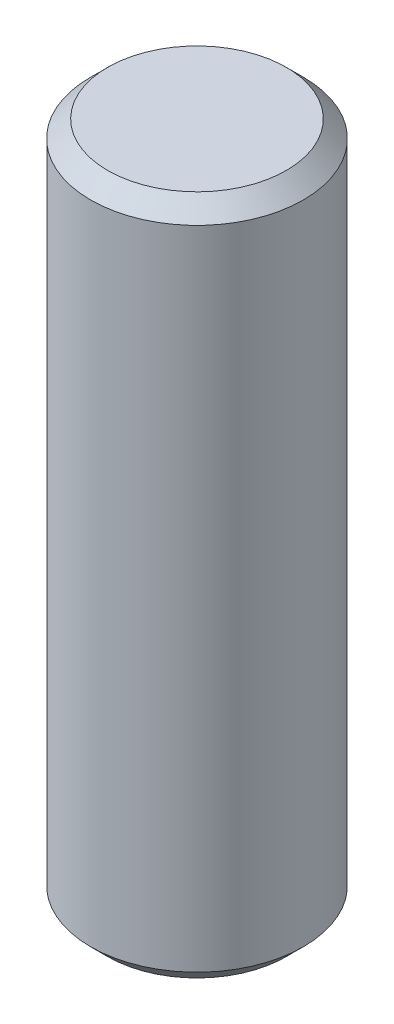
ISO-10303-21;
HEADER;
FILE_DESCRIPTION(('STEP AP214'),'2;1');
FILE_NAME('part.step','',(''),(''),'','','');
FILE_SCHEMA(('AUTOMOTIVE_DESIGN { 1 0 10303 214 1 1 1 1 }'));
ENDSEC;
DATA;
#1=APPLICATION_CONTEXT('core data for automotive mechanical design processes');
#2=APPLICATION_PROTOCOL_DEFINITION('international standard','automotive_design',2000,#1);
#3=PRODUCT_CONTEXT('',#1,'mechanical');
#4=PRODUCT('Part','Part','',(#3));
#5=PRODUCT_RELATED_PRODUCT_CATEGORY('part','',(#4));
#6=PRODUCT_DEFINITION_FORMATION('','',#4);
#7=PRODUCT_DEFINITION_CONTEXT('part definition',#1,'design');
#8=PRODUCT_DEFINITION('design','',#6,#7);
#9=PRODUCT_DEFINITION_SHAPE('','',#8);
#10=(LENGTH_UNIT() NAMED_UNIT(*) SI_UNIT(.MILLI.,.METRE.));
#11=(NAMED_UNIT(*) PLANE_ANGLE_UNIT() SI_UNIT($,.RADIAN.));
#12=(NAMED_UNIT(*) SI_UNIT($,.STERADIAN.) SOLID_ANGLE_UNIT());
#13=UNCERTAINTY_MEASURE_WITH_UNIT(LENGTH_MEASURE(1.E-05),#10,'distance_accuracy_value','');
#14=(GEOMETRIC_REPRESENTATION_CONTEXT(3) GLOBAL_UNCERTAINTY_ASSIGNED_CONTEXT((#13)) GLOBAL_UNIT_ASSIGNED_CONTEXT((#10,
#11,#12)) REPRESENTATION_CONTEXT('',''));
#15=CARTESIAN_POINT('',(0.,0.,0.));
#16=DIRECTION('',(0.,0.,1.));
#17=DIRECTION('',(1.,0.,0.));
#18=AXIS2_PLACEMENT_3D('',#15,#16,#17);
#19=CARTESIAN_POINT('',(0.,-5.08,0.));
#20=DIRECTION('',(0.,1.,0.));
#21=DIRECTION('',(0.,0.,1.));
#22=AXIS2_PLACEMENT_3D('',#19,#20,#21);
#23=CYLINDRICAL_SURFACE('',#22,1.5875);
#24=CARTESIAN_POINT('',(0.,-4.826,0.));
#25=DIRECTION('',(0.,1.,0.));
#26=DIRECTION('',(0.,0.,1.));
#27=AXIS2_PLACEMENT_3D('',#24,#25,#26);
#28=CIRCLE('',#27,1.5875);
#29=CARTESIAN_POINT('',(0.,-4.826,1.5875));
#30=VERTEX_POINT('',#29);
#31=EDGE_CURVE('E41',#30,#30,#28,.T.);
#32=ORIENTED_EDGE('',*,*,#31,.T.);
#33=EDGE_LOOP('',(#32));
#34=FACE_BOUND('',#33,.T.);
#35=CARTESIAN_POINT('',(0.,4.826,0.));
#36=DIRECTION('',(0.,1.,0.));
#37=DIRECTION('',(0.,0.,1.));
#38=AXIS2_PLACEMENT_3D('',#35,#36,#37);
#39=CIRCLE('',#38,1.5875);
#40=CARTESIAN_POINT('',(0.,4.826,1.5875));
#41=VERTEX_POINT('',#40);
#42=EDGE_CURVE('E45',#41,#41,#39,.F.);
#43=ORIENTED_EDGE('',*,*,#42,.T.);
#44=EDGE_LOOP('',(#43));
#45=FACE_BOUND('',#44,.T.);
#46=ADVANCED_FACE('F30',(#34,#45),#23,.T.);
#47=CARTESIAN_POINT('',(0.,-5.08,0.));
#48=DIRECTION('',(0.,1.,0.));
#49=DIRECTION('',(0.,0.,1.));
#50=AXIS2_PLACEMENT_3D('',#47,#48,#49);
#51=PLANE('',#50);
#52=CARTESIAN_POINT('',(0.,-5.08,0.));
#53=DIRECTION('',(0.,1.,0.));
#54=DIRECTION('',(0.,0.,1.));
#55=AXIS2_PLACEMENT_3D('',#52,#53,#54);
#56=CIRCLE('',#55,1.3335);
#57=CARTESIAN_POINT('',(0.,-5.08,1.3335));
#58=VERTEX_POINT('',#57);
#59=EDGE_CURVE('E37',#58,#58,#56,.F.);
#60=ORIENTED_EDGE('',*,*,#59,.T.);
#61=EDGE_LOOP('',(#60));
#62=FACE_BOUND('',#61,.T.);
#63=ADVANCED_FACE('F61',(#62),#51,.F.);
#64=CARTESIAN_POINT('',(0.,5.08,0.));
#65=DIRECTION('',(0.,1.,0.));
#66=DIRECTION('',(0.,0.,1.));
#67=AXIS2_PLACEMENT_3D('',#64,#65,#66);
#68=PLANE('',#67);
#69=CARTESIAN_POINT('',(0.,5.08,0.));
#70=DIRECTION('',(0.,1.,0.));
#71=DIRECTION('',(0.,0.,1.));
#72=AXIS2_PLACEMENT_3D('',#69,#70,#71);
#73=CIRCLE('',#72,1.3335);
#74=CARTESIAN_POINT('',(0.,5.08,1.3335));
#75=VERTEX_POINT('',#74);
#76=EDGE_CURVE('E10',#75,#75,#73,.T.);
#77=ORIENTED_EDGE('',*,*,#76,.T.);
#78=EDGE_LOOP('',(#77));
#79=FACE_BOUND('',#78,.T.);
#80=ADVANCED_FACE('F58',(#79),#68,.T.);
#81=CARTESIAN_POINT('',(0.,-4.826,0.));
#82=DIRECTION('',(0.,1.,0.));
#83=DIRECTION('',(0.,0.,1.));
#84=AXIS2_PLACEMENT_3D('',#81,#82,#83);
#85=CONICAL_SURFACE('',#84,1.5875,0.785398163397452);
#86=ORIENTED_EDGE('',*,*,#59,.F.);
#87=EDGE_LOOP('',(#86));
#88=FACE_BOUND('',#87,.T.);
#89=ORIENTED_EDGE('',*,*,#31,.F.);
#90=EDGE_LOOP('',(#89));
#91=FACE_BOUND('',#90,.T.);
#92=ADVANCED_FACE('F54',(#88,#91),#85,.T.);
#93=CARTESIAN_POINT('',(0.,5.08,0.));
#94=DIRECTION('',(0.,-1.,0.));
#95=DIRECTION('',(0.,0.,-1.));
#96=AXIS2_PLACEMENT_3D('',#93,#94,#95);
#97=CONICAL_SURFACE('',#96,1.3335,0.785398163397447);
#98=ORIENTED_EDGE('',*,*,#42,.F.);
#99=EDGE_LOOP('',(#98));
#100=FACE_BOUND('',#99,.T.);
#101=ORIENTED_EDGE('',*,*,#76,.F.);
#102=EDGE_LOOP('',(#101));
#103=FACE_BOUND('',#102,.T.);
#104=ADVANCED_FACE('F32',(#100,#103),#97,.T.);
#105=CLOSED_SHELL('',(#46,#63,#80,#92,#104));
#106=MANIFOLD_SOLID_BREP('B2',#105);
#107=ADVANCED_BREP_SHAPE_REPRESENTATION('',(#18,#106),#14);
#108=SHAPE_DEFINITION_REPRESENTATION(#9,#107);
ENDSEC;
END-ISO-10303-21;
